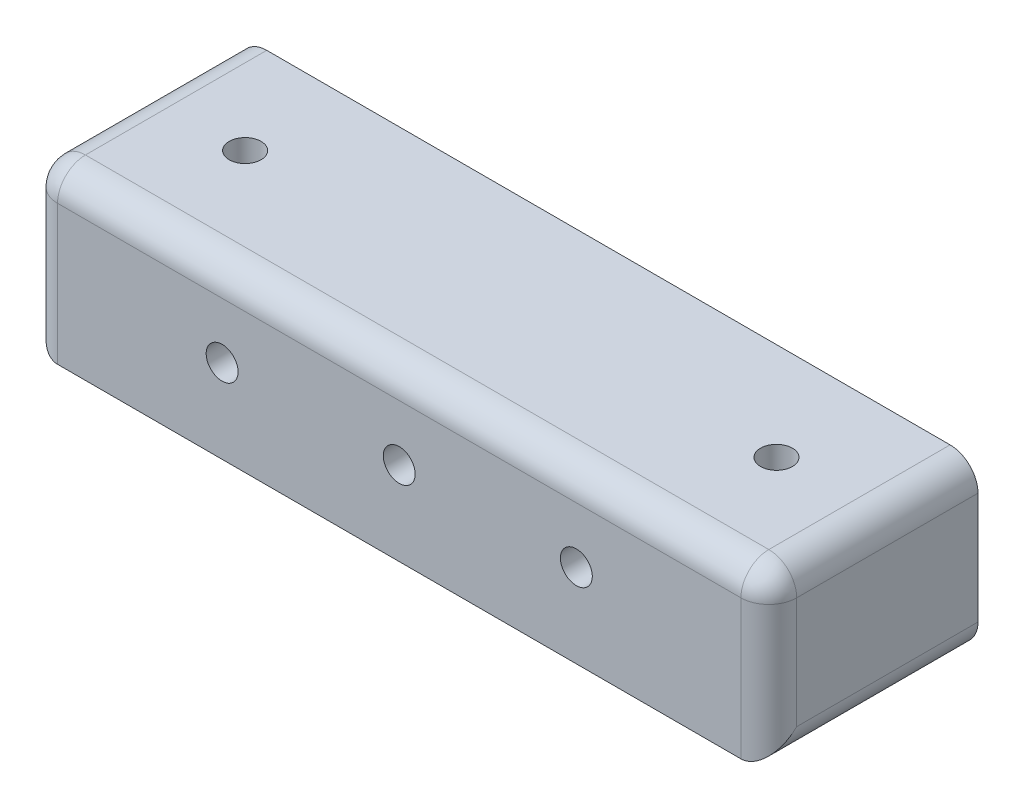
ISO-10303-21;
HEADER;
FILE_DESCRIPTION(('STEP AP214'),'2;1');
FILE_NAME('part.step','',(''),(''),'','','');
FILE_SCHEMA(('AUTOMOTIVE_DESIGN { 1 0 10303 214 1 1 1 1 }'));
ENDSEC;
DATA;
#1=APPLICATION_CONTEXT('core data for automotive mechanical design processes');
#2=APPLICATION_PROTOCOL_DEFINITION('international standard','automotive_design',2000,#1);
#3=PRODUCT_CONTEXT('',#1,'mechanical');
#4=PRODUCT('Part','Part','',(#3));
#5=PRODUCT_RELATED_PRODUCT_CATEGORY('part','',(#4));
#6=PRODUCT_DEFINITION_FORMATION('','',#4);
#7=PRODUCT_DEFINITION_CONTEXT('part definition',#1,'design');
#8=PRODUCT_DEFINITION('design','',#6,#7);
#9=PRODUCT_DEFINITION_SHAPE('','',#8);
#10=(LENGTH_UNIT() NAMED_UNIT(*) SI_UNIT(.MILLI.,.METRE.));
#11=(NAMED_UNIT(*) PLANE_ANGLE_UNIT() SI_UNIT($,.RADIAN.));
#12=(NAMED_UNIT(*) SI_UNIT($,.STERADIAN.) SOLID_ANGLE_UNIT());
#13=UNCERTAINTY_MEASURE_WITH_UNIT(LENGTH_MEASURE(1.E-05),#10,'distance_accuracy_value','');
#14=(GEOMETRIC_REPRESENTATION_CONTEXT(3) GLOBAL_UNCERTAINTY_ASSIGNED_CONTEXT((#13)) GLOBAL_UNIT_ASSIGNED_CONTEXT((#10,
#11,#12)) REPRESENTATION_CONTEXT('',''));
#15=CARTESIAN_POINT('',(0.,0.,0.));
#16=DIRECTION('',(0.,0.,1.));
#17=DIRECTION('',(1.,0.,0.));
#18=AXIS2_PLACEMENT_3D('',#15,#16,#17);
#19=CARTESIAN_POINT('',(26.5,6.,15.));
#20=DIRECTION('',(-1.,0.,0.));
#21=DIRECTION('',(0.,0.,1.));
#22=AXIS2_PLACEMENT_3D('',#19,#20,#21);
#23=PLANE('',#22);
#24=DIRECTION('',(0.,1.,0.));
#25=VECTOR('',#24,1.);
#26=CARTESIAN_POINT('',(26.5,6.,0.));
#27=LINE('',#26,#25);
#28=CARTESIAN_POINT('',(26.5,-4.,0.));
#29=VERTEX_POINT('',#28);
#30=CARTESIAN_POINT('',(26.5,4.,0.));
#31=VERTEX_POINT('',#30);
#32=EDGE_CURVE('E190',#29,#31,#27,.T.);
#33=ORIENTED_EDGE('',*,*,#32,.T.);
#34=DIRECTION('',(0.,0.,-1.));
#35=VECTOR('',#34,1.);
#36=CARTESIAN_POINT('',(26.5,4.,15.));
#37=LINE('',#36,#35);
#38=CARTESIAN_POINT('',(26.5,4.,13.));
#39=VERTEX_POINT('',#38);
#40=EDGE_CURVE('E174',#31,#39,#37,.F.);
#41=ORIENTED_EDGE('',*,*,#40,.T.);
#42=DIRECTION('',(0.,1.,0.));
#43=VECTOR('',#42,1.);
#44=CARTESIAN_POINT('',(26.5,-6.,13.));
#45=LINE('',#44,#43);
#46=CARTESIAN_POINT('',(26.5,-4.,13.));
#47=VERTEX_POINT('',#46);
#48=EDGE_CURVE('E176',#39,#47,#45,.F.);
#49=ORIENTED_EDGE('',*,*,#48,.T.);
#50=DIRECTION('',(0.,0.,-1.));
#51=VECTOR('',#50,1.);
#52=CARTESIAN_POINT('',(26.5,-4.,15.));
#53=LINE('',#52,#51);
#54=EDGE_CURVE('E178',#47,#29,#53,.T.);
#55=ORIENTED_EDGE('',*,*,#54,.T.);
#56=EDGE_LOOP('',(#33,#41,#49,#55));
#57=FACE_BOUND('',#56,.T.);
#58=ADVANCED_FACE('F33',(#57),#23,.F.);
#59=CARTESIAN_POINT('',(-26.5,6.,15.));
#60=DIRECTION('',(0.,-1.,0.));
#61=DIRECTION('',(0.,0.,-1.));
#62=AXIS2_PLACEMENT_3D('',#59,#60,#61);
#63=PLANE('',#62);
#64=CARTESIAN_POINT('',(19.05,6.,7.));
#65=DIRECTION('',(0.,-1.,0.));
#66=DIRECTION('',(0.,0.,-1.));
#67=AXIS2_PLACEMENT_3D('',#64,#65,#66);
#68=CIRCLE('',#67,1.143);
#69=CARTESIAN_POINT('',(19.05,6.,5.857));
#70=VERTEX_POINT('',#69);
#71=EDGE_CURVE('E135',#70,#70,#68,.F.);
#72=ORIENTED_EDGE('',*,*,#71,.F.);
#73=EDGE_LOOP('',(#72));
#74=FACE_BOUND('',#73,.T.);
#75=CARTESIAN_POINT('',(-19.05,6.,7.));
#76=DIRECTION('',(0.,-1.,0.));
#77=DIRECTION('',(0.,0.,-1.));
#78=AXIS2_PLACEMENT_3D('',#75,#76,#77);
#79=CIRCLE('',#78,1.143);
#80=CARTESIAN_POINT('',(-19.05,6.,5.857));
#81=VERTEX_POINT('',#80);
#82=EDGE_CURVE('E192',#81,#81,#79,.F.);
#83=ORIENTED_EDGE('',*,*,#82,.F.);
#84=EDGE_LOOP('',(#83));
#85=FACE_BOUND('',#84,.T.);
#86=DIRECTION('',(-1.,0.,0.));
#87=VECTOR('',#86,1.);
#88=CARTESIAN_POINT('',(-26.5,6.,0.));
#89=LINE('',#88,#87);
#90=CARTESIAN_POINT('',(24.5,6.,0.));
#91=VERTEX_POINT('',#90);
#92=CARTESIAN_POINT('',(-24.5,6.,0.));
#93=VERTEX_POINT('',#92);
#94=EDGE_CURVE('E187',#91,#93,#89,.T.);
#95=ORIENTED_EDGE('',*,*,#94,.T.);
#96=DIRECTION('',(0.,0.,-1.));
#97=VECTOR('',#96,1.);
#98=CARTESIAN_POINT('',(-24.5,6.,15.));
#99=LINE('',#98,#97);
#100=CARTESIAN_POINT('',(-24.5,6.,13.));
#101=VERTEX_POINT('',#100);
#102=EDGE_CURVE('E168',#93,#101,#99,.F.);
#103=ORIENTED_EDGE('',*,*,#102,.T.);
#104=DIRECTION('',(-1.,0.,0.));
#105=VECTOR('',#104,1.);
#106=CARTESIAN_POINT('',(26.5,6.,13.));
#107=LINE('',#106,#105);
#108=CARTESIAN_POINT('',(24.5,6.,13.));
#109=VERTEX_POINT('',#108);
#110=EDGE_CURVE('E170',#101,#109,#107,.F.);
#111=ORIENTED_EDGE('',*,*,#110,.T.);
#112=DIRECTION('',(0.,0.,-1.));
#113=VECTOR('',#112,1.);
#114=CARTESIAN_POINT('',(24.5,6.,15.));
#115=LINE('',#114,#113);
#116=EDGE_CURVE('E172',#109,#91,#115,.T.);
#117=ORIENTED_EDGE('',*,*,#116,.T.);
#118=EDGE_LOOP('',(#95,#103,#111,#117));
#119=FACE_BOUND('',#118,.T.);
#120=ADVANCED_FACE('F246',(#74,#85,#119),#63,.F.);
#121=CARTESIAN_POINT('',(-26.5,6.,15.));
#122=DIRECTION('',(1.,0.,0.));
#123=DIRECTION('',(0.,0.,-1.));
#124=AXIS2_PLACEMENT_3D('',#121,#122,#123);
#125=PLANE('',#124);
#126=DIRECTION('',(0.,-1.,0.));
#127=VECTOR('',#126,1.);
#128=CARTESIAN_POINT('',(-26.5,6.,13.));
#129=LINE('',#128,#127);
#130=CARTESIAN_POINT('',(-26.5,-4.,13.));
#131=VERTEX_POINT('',#130);
#132=CARTESIAN_POINT('',(-26.5,4.,13.));
#133=VERTEX_POINT('',#132);
#134=EDGE_CURVE('E131',#131,#133,#129,.F.);
#135=ORIENTED_EDGE('',*,*,#134,.T.);
#136=DIRECTION('',(0.,0.,-1.));
#137=VECTOR('',#136,1.);
#138=CARTESIAN_POINT('',(-26.5,4.,15.));
#139=LINE('',#138,#137);
#140=CARTESIAN_POINT('',(-26.5,4.,0.));
#141=VERTEX_POINT('',#140);
#142=EDGE_CURVE('E163',#133,#141,#139,.T.);
#143=ORIENTED_EDGE('',*,*,#142,.T.);
#144=DIRECTION('',(0.,-1.,0.));
#145=VECTOR('',#144,1.);
#146=CARTESIAN_POINT('',(-26.5,6.,0.));
#147=LINE('',#146,#145);
#148=CARTESIAN_POINT('',(-26.5,-4.,0.));
#149=VERTEX_POINT('',#148);
#150=EDGE_CURVE('E184',#141,#149,#147,.T.);
#151=ORIENTED_EDGE('',*,*,#150,.T.);
#152=DIRECTION('',(0.,0.,-1.));
#153=VECTOR('',#152,1.);
#154=CARTESIAN_POINT('',(-26.5,-4.,15.));
#155=LINE('',#154,#153);
#156=EDGE_CURVE('E166',#149,#131,#155,.F.);
#157=ORIENTED_EDGE('',*,*,#156,.T.);
#158=EDGE_LOOP('',(#135,#143,#151,#157));
#159=FACE_BOUND('',#158,.T.);
#160=ADVANCED_FACE('F282',(#159),#125,.F.);
#161=CARTESIAN_POINT('',(-26.5,-6.,15.));
#162=DIRECTION('',(0.,1.,0.));
#163=DIRECTION('',(0.,0.,1.));
#164=AXIS2_PLACEMENT_3D('',#161,#162,#163);
#165=PLANE('',#164);
#166=CARTESIAN_POINT('',(19.05,-6.,7.));
#167=DIRECTION('',(0.,-1.,0.));
#168=DIRECTION('',(0.,0.,-1.));
#169=AXIS2_PLACEMENT_3D('',#166,#167,#168);
#170=CIRCLE('',#169,1.143);
#171=CARTESIAN_POINT('',(19.05,-6.,5.857));
#172=VERTEX_POINT('',#171);
#173=EDGE_CURVE('E132',#172,#172,#170,.T.);
#174=ORIENTED_EDGE('',*,*,#173,.F.);
#175=EDGE_LOOP('',(#174));
#176=FACE_BOUND('',#175,.T.);
#177=CARTESIAN_POINT('',(-19.05,-6.,7.));
#178=DIRECTION('',(0.,-1.,0.));
#179=DIRECTION('',(0.,0.,-1.));
#180=AXIS2_PLACEMENT_3D('',#177,#178,#179);
#181=CIRCLE('',#180,1.143);
#182=CARTESIAN_POINT('',(-19.05,-6.,5.857));
#183=VERTEX_POINT('',#182);
#184=EDGE_CURVE('E196',#183,#183,#181,.T.);
#185=ORIENTED_EDGE('',*,*,#184,.F.);
#186=EDGE_LOOP('',(#185));
#187=FACE_BOUND('',#186,.T.);
#188=DIRECTION('',(1.,0.,0.));
#189=VECTOR('',#188,1.);
#190=CARTESIAN_POINT('',(-26.5,-6.,0.));
#191=LINE('',#190,#189);
#192=CARTESIAN_POINT('',(-24.5,-6.,0.));
#193=VERTEX_POINT('',#192);
#194=CARTESIAN_POINT('',(24.5,-6.,0.));
#195=VERTEX_POINT('',#194);
#196=EDGE_CURVE('E120',#193,#195,#191,.T.);
#197=ORIENTED_EDGE('',*,*,#196,.T.);
#198=DIRECTION('',(0.,0.,-1.));
#199=VECTOR('',#198,1.);
#200=CARTESIAN_POINT('',(24.5,-6.,15.));
#201=LINE('',#200,#199);
#202=CARTESIAN_POINT('',(24.5,-6.,15.));
#203=VERTEX_POINT('',#202);
#204=EDGE_CURVE('E11',#195,#203,#201,.F.);
#205=ORIENTED_EDGE('',*,*,#204,.T.);
#206=DIRECTION('',(1.,0.,0.));
#207=VECTOR('',#206,1.);
#208=CARTESIAN_POINT('',(-26.5,-6.,15.));
#209=LINE('',#208,#207);
#210=CARTESIAN_POINT('',(-24.5,-6.,15.));
#211=VERTEX_POINT('',#210);
#212=EDGE_CURVE('E109',#211,#203,#209,.T.);
#213=ORIENTED_EDGE('',*,*,#212,.F.);
#214=DIRECTION('',(0.,0.,-1.));
#215=VECTOR('',#214,1.);
#216=CARTESIAN_POINT('',(-24.5,-6.,15.));
#217=LINE('',#216,#215);
#218=EDGE_CURVE('E42',#211,#193,#217,.T.);
#219=ORIENTED_EDGE('',*,*,#218,.T.);
#220=EDGE_LOOP('',(#197,#205,#213,#219));
#221=FACE_BOUND('',#220,.T.);
#222=ADVANCED_FACE('F118',(#176,#187,#221),#165,.F.);
#223=CARTESIAN_POINT('',(0.,0.,15.));
#224=DIRECTION('',(0.,0.,1.));
#225=DIRECTION('',(1.,0.,0.));
#226=AXIS2_PLACEMENT_3D('',#223,#224,#225);
#227=PLANE('',#226);
#228=CARTESIAN_POINT('',(0.,0.,15.));
#229=DIRECTION('',(0.,0.,-1.));
#230=DIRECTION('',(-1.,0.,0.));
#231=AXIS2_PLACEMENT_3D('',#228,#229,#230);
#232=CIRCLE('',#231,1.143);
#233=CARTESIAN_POINT('',(-1.14299999999999,0.,15.));
#234=VERTEX_POINT('',#233);
#235=EDGE_CURVE('E210',#234,#234,#232,.T.);
#236=ORIENTED_EDGE('',*,*,#235,.T.);
#237=EDGE_LOOP('',(#236));
#238=FACE_BOUND('',#237,.T.);
#239=CARTESIAN_POINT('',(-12.7,0.,15.));
#240=DIRECTION('',(0.,0.,-1.));
#241=DIRECTION('',(-1.,0.,0.));
#242=AXIS2_PLACEMENT_3D('',#239,#240,#241);
#243=CIRCLE('',#242,1.143);
#244=CARTESIAN_POINT('',(-13.843,0.,15.));
#245=VERTEX_POINT('',#244);
#246=EDGE_CURVE('E204',#245,#245,#243,.T.);
#247=ORIENTED_EDGE('',*,*,#246,.T.);
#248=EDGE_LOOP('',(#247));
#249=FACE_BOUND('',#248,.T.);
#250=CARTESIAN_POINT('',(12.7,0.,15.));
#251=DIRECTION('',(0.,0.,-1.));
#252=DIRECTION('',(-1.,0.,0.));
#253=AXIS2_PLACEMENT_3D('',#250,#251,#252);
#254=CIRCLE('',#253,1.143);
#255=CARTESIAN_POINT('',(11.557,0.,15.));
#256=VERTEX_POINT('',#255);
#257=EDGE_CURVE('E156',#256,#256,#254,.T.);
#258=ORIENTED_EDGE('',*,*,#257,.T.);
#259=EDGE_LOOP('',(#258));
#260=FACE_BOUND('',#259,.T.);
#261=ORIENTED_EDGE('',*,*,#212,.T.);
#262=DIRECTION('',(0.,1.,0.));
#263=VECTOR('',#262,1.);
#264=CARTESIAN_POINT('',(24.5,6.,15.));
#265=LINE('',#264,#263);
#266=CARTESIAN_POINT('',(24.5,4.,15.));
#267=VERTEX_POINT('',#266);
#268=EDGE_CURVE('E180',#203,#267,#265,.T.);
#269=ORIENTED_EDGE('',*,*,#268,.T.);
#270=DIRECTION('',(-1.,0.,0.));
#271=VECTOR('',#270,1.);
#272=CARTESIAN_POINT('',(-26.5,4.,15.));
#273=LINE('',#272,#271);
#274=CARTESIAN_POINT('',(-24.5,4.,15.));
#275=VERTEX_POINT('',#274);
#276=EDGE_CURVE('E112',#267,#275,#273,.T.);
#277=ORIENTED_EDGE('',*,*,#276,.T.);
#278=DIRECTION('',(0.,-1.,0.));
#279=VECTOR('',#278,1.);
#280=CARTESIAN_POINT('',(-24.5,-6.,15.));
#281=LINE('',#280,#279);
#282=EDGE_CURVE('E106',#275,#211,#281,.T.);
#283=ORIENTED_EDGE('',*,*,#282,.T.);
#284=EDGE_LOOP('',(#261,#269,#277,#283));
#285=FACE_BOUND('',#284,.T.);
#286=ADVANCED_FACE('F107',(#238,#249,#260,#285),#227,.T.);
#287=CARTESIAN_POINT('',(0.,0.,0.));
#288=DIRECTION('',(0.,0.,1.));
#289=DIRECTION('',(1.,0.,0.));
#290=AXIS2_PLACEMENT_3D('',#287,#288,#289);
#291=PLANE('',#290);
#292=CARTESIAN_POINT('',(0.,0.,0.));
#293=DIRECTION('',(0.,0.,-1.));
#294=DIRECTION('',(-1.,0.,0.));
#295=AXIS2_PLACEMENT_3D('',#292,#293,#294);
#296=CIRCLE('',#295,1.143);
#297=CARTESIAN_POINT('',(-1.14299999999999,0.,0.));
#298=VERTEX_POINT('',#297);
#299=EDGE_CURVE('E213',#298,#298,#296,.T.);
#300=ORIENTED_EDGE('',*,*,#299,.F.);
#301=EDGE_LOOP('',(#300));
#302=FACE_BOUND('',#301,.T.);
#303=CARTESIAN_POINT('',(-12.7,0.,0.));
#304=DIRECTION('',(0.,0.,-1.));
#305=DIRECTION('',(-1.,0.,0.));
#306=AXIS2_PLACEMENT_3D('',#303,#304,#305);
#307=CIRCLE('',#306,1.143);
#308=CARTESIAN_POINT('',(-13.843,0.,0.));
#309=VERTEX_POINT('',#308);
#310=EDGE_CURVE('E207',#309,#309,#307,.T.);
#311=ORIENTED_EDGE('',*,*,#310,.F.);
#312=EDGE_LOOP('',(#311));
#313=FACE_BOUND('',#312,.T.);
#314=CARTESIAN_POINT('',(12.7,0.,0.));
#315=DIRECTION('',(0.,0.,-1.));
#316=DIRECTION('',(-1.,0.,0.));
#317=AXIS2_PLACEMENT_3D('',#314,#315,#316);
#318=CIRCLE('',#317,1.143);
#319=CARTESIAN_POINT('',(11.557,0.,0.));
#320=VERTEX_POINT('',#319);
#321=EDGE_CURVE('E201',#320,#320,#318,.T.);
#322=ORIENTED_EDGE('',*,*,#321,.F.);
#323=EDGE_LOOP('',(#322));
#324=FACE_BOUND('',#323,.T.);
#325=ORIENTED_EDGE('',*,*,#150,.F.);
#326=CARTESIAN_POINT('',(-24.5,4.,0.));
#327=DIRECTION('',(0.,0.,1.));
#328=DIRECTION('',(1.,0.,0.));
#329=AXIS2_PLACEMENT_3D('',#326,#327,#328);
#330=CIRCLE('',#329,2.);
#331=EDGE_CURVE('E128',#141,#93,#330,.F.);
#332=ORIENTED_EDGE('',*,*,#331,.T.);
#333=ORIENTED_EDGE('',*,*,#94,.F.);
#334=CARTESIAN_POINT('',(24.5,4.,0.));
#335=DIRECTION('',(0.,0.,1.));
#336=DIRECTION('',(1.,0.,0.));
#337=AXIS2_PLACEMENT_3D('',#334,#335,#336);
#338=CIRCLE('',#337,2.);
#339=EDGE_CURVE('E159',#91,#31,#338,.F.);
#340=ORIENTED_EDGE('',*,*,#339,.T.);
#341=ORIENTED_EDGE('',*,*,#32,.F.);
#342=CARTESIAN_POINT('',(24.5,-4.,0.));
#343=DIRECTION('',(0.,0.,1.));
#344=DIRECTION('',(1.,0.,0.));
#345=AXIS2_PLACEMENT_3D('',#342,#343,#344);
#346=CIRCLE('',#345,2.);
#347=EDGE_CURVE('E50',#29,#195,#346,.F.);
#348=ORIENTED_EDGE('',*,*,#347,.T.);
#349=ORIENTED_EDGE('',*,*,#196,.F.);
#350=CARTESIAN_POINT('',(-24.5,-4.,0.));
#351=DIRECTION('',(0.,0.,1.));
#352=DIRECTION('',(1.,0.,0.));
#353=AXIS2_PLACEMENT_3D('',#350,#351,#352);
#354=CIRCLE('',#353,2.);
#355=EDGE_CURVE('E127',#193,#149,#354,.F.);
#356=ORIENTED_EDGE('',*,*,#355,.T.);
#357=EDGE_LOOP('',(#325,#332,#333,#340,#341,#348,#349,#356));
#358=FACE_BOUND('',#357,.T.);
#359=ADVANCED_FACE('F228',(#302,#313,#324,#358),#291,.F.);
#360=CARTESIAN_POINT('',(-19.05,6.001,7.));
#361=DIRECTION('',(0.,-1.,0.));
#362=DIRECTION('',(0.,0.,-1.));
#363=AXIS2_PLACEMENT_3D('',#360,#361,#362);
#364=CYLINDRICAL_SURFACE('',#363,1.143);
#365=ORIENTED_EDGE('',*,*,#184,.T.);
#366=EDGE_LOOP('',(#365));
#367=FACE_BOUND('',#366,.T.);
#368=ORIENTED_EDGE('',*,*,#82,.T.);
#369=EDGE_LOOP('',(#368));
#370=FACE_BOUND('',#369,.T.);
#371=ADVANCED_FACE('F231',(#367,#370),#364,.F.);
#372=CARTESIAN_POINT('',(19.05,6.001,7.));
#373=DIRECTION('',(0.,-1.,0.));
#374=DIRECTION('',(0.,0.,-1.));
#375=AXIS2_PLACEMENT_3D('',#372,#373,#374);
#376=CYLINDRICAL_SURFACE('',#375,1.143);
#377=ORIENTED_EDGE('',*,*,#173,.T.);
#378=EDGE_LOOP('',(#377));
#379=FACE_BOUND('',#378,.T.);
#380=ORIENTED_EDGE('',*,*,#71,.T.);
#381=EDGE_LOOP('',(#380));
#382=FACE_BOUND('',#381,.T.);
#383=ADVANCED_FACE('F372',(#379,#382),#376,.F.);
#384=CARTESIAN_POINT('',(-24.5,-4.,15.));
#385=DIRECTION('',(0.,0.,-1.));
#386=DIRECTION('',(-1.,0.,0.));
#387=AXIS2_PLACEMENT_3D('',#384,#385,#386);
#388=CYLINDRICAL_SURFACE('',#387,2.);
#389=ORIENTED_EDGE('',*,*,#355,.F.);
#390=ORIENTED_EDGE('',*,*,#218,.F.);
#391=CARTESIAN_POINT('',(-24.5,-4.,13.));
#392=DIRECTION('',(0.,-0.707106781186547,-0.707106781186547));
#393=DIRECTION('',(0.,0.707106781186547,-0.707106781186547));
#394=AXIS2_PLACEMENT_3D('',#391,#392,#393);
#395=ELLIPSE('',#394,2.82842712474619,2.);
#396=EDGE_CURVE('E37',#131,#211,#395,.F.);
#397=ORIENTED_EDGE('',*,*,#396,.F.);
#398=ORIENTED_EDGE('',*,*,#156,.F.);
#399=EDGE_LOOP('',(#389,#390,#397,#398));
#400=FACE_BOUND('',#399,.T.);
#401=ADVANCED_FACE('F35',(#400),#388,.T.);
#402=CARTESIAN_POINT('',(-24.5,0.,13.));
#403=DIRECTION('',(0.,1.,0.));
#404=DIRECTION('',(0.,0.,1.));
#405=AXIS2_PLACEMENT_3D('',#402,#403,#404);
#406=CYLINDRICAL_SURFACE('',#405,2.);
#407=ORIENTED_EDGE('',*,*,#396,.T.);
#408=ORIENTED_EDGE('',*,*,#282,.F.);
#409=CARTESIAN_POINT('',(-24.5,4.,13.));
#410=DIRECTION('',(0.,1.,0.));
#411=DIRECTION('',(0.,0.,1.));
#412=AXIS2_PLACEMENT_3D('',#409,#410,#411);
#413=CIRCLE('',#412,2.);
#414=EDGE_CURVE('E133',#133,#275,#413,.T.);
#415=ORIENTED_EDGE('',*,*,#414,.F.);
#416=ORIENTED_EDGE('',*,*,#134,.F.);
#417=EDGE_LOOP('',(#407,#408,#415,#416));
#418=FACE_BOUND('',#417,.T.);
#419=ADVANCED_FACE('F130',(#418),#406,.T.);
#420=CARTESIAN_POINT('',(-24.5,4.,15.));
#421=DIRECTION('',(0.,0.,-1.));
#422=DIRECTION('',(-1.,0.,0.));
#423=AXIS2_PLACEMENT_3D('',#420,#421,#422);
#424=CYLINDRICAL_SURFACE('',#423,2.);
#425=ORIENTED_EDGE('',*,*,#331,.F.);
#426=ORIENTED_EDGE('',*,*,#142,.F.);
#427=CARTESIAN_POINT('',(-24.5,4.,13.));
#428=DIRECTION('',(0.,0.,1.));
#429=DIRECTION('',(1.,0.,0.));
#430=AXIS2_PLACEMENT_3D('',#427,#428,#429);
#431=CIRCLE('',#430,2.);
#432=EDGE_CURVE('E137',#101,#133,#431,.T.);
#433=ORIENTED_EDGE('',*,*,#432,.F.);
#434=ORIENTED_EDGE('',*,*,#102,.F.);
#435=EDGE_LOOP('',(#425,#426,#433,#434));
#436=FACE_BOUND('',#435,.T.);
#437=ADVANCED_FACE('F243',(#436),#424,.T.);
#438=CARTESIAN_POINT('',(-24.5,4.,13.));
#439=DIRECTION('',(0.,0.,1.));
#440=DIRECTION('',(1.,0.,0.));
#441=AXIS2_PLACEMENT_3D('',#438,#439,#440);
#442=SPHERICAL_SURFACE('',#441,2.);
#443=ORIENTED_EDGE('',*,*,#432,.T.);
#444=ORIENTED_EDGE('',*,*,#414,.T.);
#445=CARTESIAN_POINT('',(-24.5,4.,13.));
#446=DIRECTION('',(-1.,0.,0.));
#447=DIRECTION('',(0.,0.,1.));
#448=AXIS2_PLACEMENT_3D('',#445,#446,#447);
#449=CIRCLE('',#448,2.);
#450=EDGE_CURVE('E142',#101,#275,#449,.F.);
#451=ORIENTED_EDGE('',*,*,#450,.F.);
#452=EDGE_LOOP('',(#443,#444,#451));
#453=FACE_BOUND('',#452,.T.);
#454=ADVANCED_FACE('F268',(#453),#442,.T.);
#455=CARTESIAN_POINT('',(0.,4.,13.));
#456=DIRECTION('',(1.,0.,0.));
#457=DIRECTION('',(0.,0.,-1.));
#458=AXIS2_PLACEMENT_3D('',#455,#456,#457);
#459=CYLINDRICAL_SURFACE('',#458,2.);
#460=ORIENTED_EDGE('',*,*,#450,.T.);
#461=ORIENTED_EDGE('',*,*,#276,.F.);
#462=CARTESIAN_POINT('',(24.5,4.,13.));
#463=DIRECTION('',(1.,0.,0.));
#464=DIRECTION('',(0.,0.,-1.));
#465=AXIS2_PLACEMENT_3D('',#462,#463,#464);
#466=CIRCLE('',#465,2.);
#467=EDGE_CURVE('E146',#109,#267,#466,.T.);
#468=ORIENTED_EDGE('',*,*,#467,.F.);
#469=ORIENTED_EDGE('',*,*,#110,.F.);
#470=EDGE_LOOP('',(#460,#461,#468,#469));
#471=FACE_BOUND('',#470,.T.);
#472=ADVANCED_FACE('F267',(#471),#459,.T.);
#473=CARTESIAN_POINT('',(24.5,4.,15.));
#474=DIRECTION('',(0.,0.,-1.));
#475=DIRECTION('',(-1.,0.,0.));
#476=AXIS2_PLACEMENT_3D('',#473,#474,#475);
#477=CYLINDRICAL_SURFACE('',#476,2.);
#478=ORIENTED_EDGE('',*,*,#339,.F.);
#479=ORIENTED_EDGE('',*,*,#116,.F.);
#480=CARTESIAN_POINT('',(24.5,4.,13.));
#481=DIRECTION('',(0.,0.,1.));
#482=DIRECTION('',(1.,0.,0.));
#483=AXIS2_PLACEMENT_3D('',#480,#481,#482);
#484=CIRCLE('',#483,2.);
#485=EDGE_CURVE('E149',#39,#109,#484,.T.);
#486=ORIENTED_EDGE('',*,*,#485,.F.);
#487=ORIENTED_EDGE('',*,*,#40,.F.);
#488=EDGE_LOOP('',(#478,#479,#486,#487));
#489=FACE_BOUND('',#488,.T.);
#490=ADVANCED_FACE('F252',(#489),#477,.T.);
#491=CARTESIAN_POINT('',(24.5,-4.,15.));
#492=DIRECTION('',(0.,0.,-1.));
#493=DIRECTION('',(-1.,0.,0.));
#494=AXIS2_PLACEMENT_3D('',#491,#492,#493);
#495=CYLINDRICAL_SURFACE('',#494,2.);
#496=ORIENTED_EDGE('',*,*,#347,.F.);
#497=ORIENTED_EDGE('',*,*,#54,.F.);
#498=CARTESIAN_POINT('',(24.5,-4.,13.));
#499=DIRECTION('',(0.,-0.707106781186547,-0.707106781186547));
#500=DIRECTION('',(0.,0.707106781186547,-0.707106781186547));
#501=AXIS2_PLACEMENT_3D('',#498,#499,#500);
#502=ELLIPSE('',#501,2.82842712474619,2.);
#503=EDGE_CURVE('E152',#203,#47,#502,.F.);
#504=ORIENTED_EDGE('',*,*,#503,.F.);
#505=ORIENTED_EDGE('',*,*,#204,.F.);
#506=EDGE_LOOP('',(#496,#497,#504,#505));
#507=FACE_BOUND('',#506,.T.);
#508=ADVANCED_FACE('F259',(#507),#495,.T.);
#509=CARTESIAN_POINT('',(24.5,4.,13.));
#510=DIRECTION('',(0.,0.,1.));
#511=DIRECTION('',(1.,0.,0.));
#512=AXIS2_PLACEMENT_3D('',#509,#510,#511);
#513=SPHERICAL_SURFACE('',#512,2.);
#514=ORIENTED_EDGE('',*,*,#485,.T.);
#515=ORIENTED_EDGE('',*,*,#467,.T.);
#516=CARTESIAN_POINT('',(24.5,4.,13.));
#517=DIRECTION('',(0.,1.,0.));
#518=DIRECTION('',(0.,0.,1.));
#519=AXIS2_PLACEMENT_3D('',#516,#517,#518);
#520=CIRCLE('',#519,2.);
#521=EDGE_CURVE('E155',#39,#267,#520,.F.);
#522=ORIENTED_EDGE('',*,*,#521,.F.);
#523=EDGE_LOOP('',(#514,#515,#522));
#524=FACE_BOUND('',#523,.T.);
#525=ADVANCED_FACE('F265',(#524),#513,.T.);
#526=CARTESIAN_POINT('',(24.5,0.,13.));
#527=DIRECTION('',(0.,-1.,0.));
#528=DIRECTION('',(0.,0.,-1.));
#529=AXIS2_PLACEMENT_3D('',#526,#527,#528);
#530=CYLINDRICAL_SURFACE('',#529,2.);
#531=ORIENTED_EDGE('',*,*,#503,.T.);
#532=ORIENTED_EDGE('',*,*,#48,.F.);
#533=ORIENTED_EDGE('',*,*,#521,.T.);
#534=ORIENTED_EDGE('',*,*,#268,.F.);
#535=EDGE_LOOP('',(#531,#532,#533,#534));
#536=FACE_BOUND('',#535,.T.);
#537=ADVANCED_FACE('F262',(#536),#530,.T.);
#538=CARTESIAN_POINT('',(12.7,0.,15.));
#539=DIRECTION('',(0.,0.,-1.));
#540=DIRECTION('',(-1.,0.,0.));
#541=AXIS2_PLACEMENT_3D('',#538,#539,#540);
#542=CYLINDRICAL_SURFACE('',#541,1.143);
#543=ORIENTED_EDGE('',*,*,#257,.F.);
#544=EDGE_LOOP('',(#543));
#545=FACE_BOUND('',#544,.T.);
#546=ORIENTED_EDGE('',*,*,#321,.T.);
#547=EDGE_LOOP('',(#546));
#548=FACE_BOUND('',#547,.T.);
#549=ADVANCED_FACE('F289',(#545,#548),#542,.F.);
#550=CARTESIAN_POINT('',(-12.7,0.,15.));
#551=DIRECTION('',(0.,0.,-1.));
#552=DIRECTION('',(-1.,0.,0.));
#553=AXIS2_PLACEMENT_3D('',#550,#551,#552);
#554=CYLINDRICAL_SURFACE('',#553,1.143);
#555=ORIENTED_EDGE('',*,*,#246,.F.);
#556=EDGE_LOOP('',(#555));
#557=FACE_BOUND('',#556,.T.);
#558=ORIENTED_EDGE('',*,*,#310,.T.);
#559=EDGE_LOOP('',(#558));
#560=FACE_BOUND('',#559,.T.);
#561=ADVANCED_FACE('F224',(#557,#560),#554,.F.);
#562=CARTESIAN_POINT('',(0.,0.,15.));
#563=DIRECTION('',(0.,0.,-1.));
#564=DIRECTION('',(-1.,0.,0.));
#565=AXIS2_PLACEMENT_3D('',#562,#563,#564);
#566=CYLINDRICAL_SURFACE('',#565,1.143);
#567=ORIENTED_EDGE('',*,*,#235,.F.);
#568=EDGE_LOOP('',(#567));
#569=FACE_BOUND('',#568,.T.);
#570=ORIENTED_EDGE('',*,*,#299,.T.);
#571=EDGE_LOOP('',(#570));
#572=FACE_BOUND('',#571,.T.);
#573=ADVANCED_FACE('F221',(#569,#572),#566,.F.);
#574=CLOSED_SHELL('',(#58,#120,#160,#222,#286,#359,#371,#383,#401,#419,#437,#454,#472,#490,#508,
#525,#537,#549,#561,#573));
#575=MANIFOLD_SOLID_BREP('B2',#574);
#576=ADVANCED_BREP_SHAPE_REPRESENTATION('',(#18,#575),#14);
#577=SHAPE_DEFINITION_REPRESENTATION(#9,#576);
ENDSEC;
END-ISO-10303-21;
